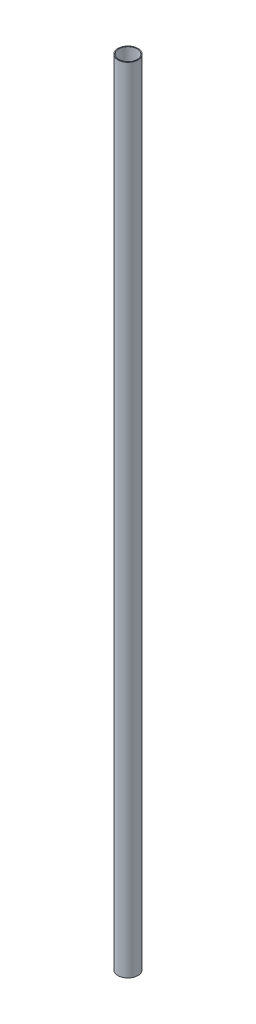
ISO-10303-21;
HEADER;
FILE_DESCRIPTION(('STEP AP214'),'2;1');
FILE_NAME('part.step','',(''),(''),'','','');
FILE_SCHEMA(('AUTOMOTIVE_DESIGN { 1 0 10303 214 1 1 1 1 }'));
ENDSEC;
DATA;
#1=APPLICATION_CONTEXT('core data for automotive mechanical design processes');
#2=APPLICATION_PROTOCOL_DEFINITION('international standard','automotive_design',2000,#1);
#3=PRODUCT_CONTEXT('',#1,'mechanical');
#4=PRODUCT('Part','Part','',(#3));
#5=PRODUCT_RELATED_PRODUCT_CATEGORY('part','',(#4));
#6=PRODUCT_DEFINITION_FORMATION('','',#4);
#7=PRODUCT_DEFINITION_CONTEXT('part definition',#1,'design');
#8=PRODUCT_DEFINITION('design','',#6,#7);
#9=PRODUCT_DEFINITION_SHAPE('','',#8);
#10=(LENGTH_UNIT() NAMED_UNIT(*) SI_UNIT(.MILLI.,.METRE.));
#11=(NAMED_UNIT(*) PLANE_ANGLE_UNIT() SI_UNIT($,.RADIAN.));
#12=(NAMED_UNIT(*) SI_UNIT($,.STERADIAN.) SOLID_ANGLE_UNIT());
#13=UNCERTAINTY_MEASURE_WITH_UNIT(LENGTH_MEASURE(1.E-05),#10,'distance_accuracy_value','');
#14=(GEOMETRIC_REPRESENTATION_CONTEXT(3) GLOBAL_UNCERTAINTY_ASSIGNED_CONTEXT((#13)) GLOBAL_UNIT_ASSIGNED_CONTEXT((#10,
#11,#12)) REPRESENTATION_CONTEXT('',''));
#15=CARTESIAN_POINT('',(0.,0.,0.));
#16=DIRECTION('',(0.,0.,1.));
#17=DIRECTION('',(1.,0.,0.));
#18=AXIS2_PLACEMENT_3D('',#15,#16,#17);
#19=CARTESIAN_POINT('',(0.,1296.55504832,0.));
#20=DIRECTION('',(0.,1.,0.));
#21=DIRECTION('',(0.,0.,1.));
#22=AXIS2_PLACEMENT_3D('',#19,#20,#21);
#23=PLANE('',#22);
#24=CARTESIAN_POINT('',(0.,1296.55504832,0.));
#25=DIRECTION('',(0.,1.,0.));
#26=DIRECTION('',(0.,0.,1.));
#27=AXIS2_PLACEMENT_3D('',#24,#25,#26);
#28=CIRCLE('',#27,16.381543329117);
#29=CARTESIAN_POINT('',(0.,1296.55504832,16.381543329117));
#30=VERTEX_POINT('',#29);
#31=EDGE_CURVE('E10',#30,#30,#28,.T.);
#32=ORIENTED_EDGE('',*,*,#31,.T.);
#33=EDGE_LOOP('',(#32));
#34=FACE_BOUND('',#33,.T.);
#35=CARTESIAN_POINT('',(0.,1296.55504832,0.));
#36=DIRECTION('',(0.,1.,0.));
#37=DIRECTION('',(0.,0.,1.));
#38=AXIS2_PLACEMENT_3D('',#35,#36,#37);
#39=CIRCLE('',#38,15.);
#40=CARTESIAN_POINT('',(0.,1296.55504832,15.));
#41=VERTEX_POINT('',#40);
#42=EDGE_CURVE('E42',#41,#41,#39,.T.);
#43=ORIENTED_EDGE('',*,*,#42,.F.);
#44=EDGE_LOOP('',(#43));
#45=FACE_BOUND('',#44,.T.);
#46=ADVANCED_FACE('F31',(#34,#45),#23,.T.);
#47=CARTESIAN_POINT('',(0.,0.,0.));
#48=DIRECTION('',(0.,1.,0.));
#49=DIRECTION('',(0.,0.,1.));
#50=AXIS2_PLACEMENT_3D('',#47,#48,#49);
#51=PLANE('',#50);
#52=CARTESIAN_POINT('',(0.,0.,0.));
#53=DIRECTION('',(0.,1.,0.));
#54=DIRECTION('',(0.,0.,1.));
#55=AXIS2_PLACEMENT_3D('',#52,#53,#54);
#56=CIRCLE('',#55,16.381543329117);
#57=CARTESIAN_POINT('',(0.,0.,16.381543329117));
#58=VERTEX_POINT('',#57);
#59=EDGE_CURVE('E35',#58,#58,#56,.T.);
#60=ORIENTED_EDGE('',*,*,#59,.F.);
#61=EDGE_LOOP('',(#60));
#62=FACE_BOUND('',#61,.T.);
#63=CARTESIAN_POINT('',(0.,0.,0.));
#64=DIRECTION('',(0.,1.,0.));
#65=DIRECTION('',(0.,0.,1.));
#66=AXIS2_PLACEMENT_3D('',#63,#64,#65);
#67=CIRCLE('',#66,15.);
#68=CARTESIAN_POINT('',(0.,0.,15.));
#69=VERTEX_POINT('',#68);
#70=EDGE_CURVE('E44',#69,#69,#67,.T.);
#71=ORIENTED_EDGE('',*,*,#70,.T.);
#72=EDGE_LOOP('',(#71));
#73=FACE_BOUND('',#72,.T.);
#74=ADVANCED_FACE('F54',(#62,#73),#51,.F.);
#75=CARTESIAN_POINT('',(0.,1296.55504832,0.));
#76=DIRECTION('',(0.,-1.,0.));
#77=DIRECTION('',(0.,0.,-1.));
#78=AXIS2_PLACEMENT_3D('',#75,#76,#77);
#79=CYLINDRICAL_SURFACE('',#78,16.381543329117);
#80=ORIENTED_EDGE('',*,*,#31,.F.);
#81=EDGE_LOOP('',(#80));
#82=FACE_BOUND('',#81,.T.);
#83=ORIENTED_EDGE('',*,*,#59,.T.);
#84=EDGE_LOOP('',(#83));
#85=FACE_BOUND('',#84,.T.);
#86=ADVANCED_FACE('F33',(#82,#85),#79,.T.);
#87=CARTESIAN_POINT('',(0.,1296.55504832,0.));
#88=DIRECTION('',(0.,-1.,0.));
#89=DIRECTION('',(0.,0.,-1.));
#90=AXIS2_PLACEMENT_3D('',#87,#88,#89);
#91=CYLINDRICAL_SURFACE('',#90,15.);
#92=ORIENTED_EDGE('',*,*,#42,.T.);
#93=EDGE_LOOP('',(#92));
#94=FACE_BOUND('',#93,.T.);
#95=ORIENTED_EDGE('',*,*,#70,.F.);
#96=EDGE_LOOP('',(#95));
#97=FACE_BOUND('',#96,.T.);
#98=ADVANCED_FACE('F50',(#94,#97),#91,.F.);
#99=CLOSED_SHELL('',(#46,#74,#86,#98));
#100=MANIFOLD_SOLID_BREP('B2',#99);
#101=ADVANCED_BREP_SHAPE_REPRESENTATION('',(#18,#100),#14);
#102=SHAPE_DEFINITION_REPRESENTATION(#9,#101);
ENDSEC;
END-ISO-10303-21;
